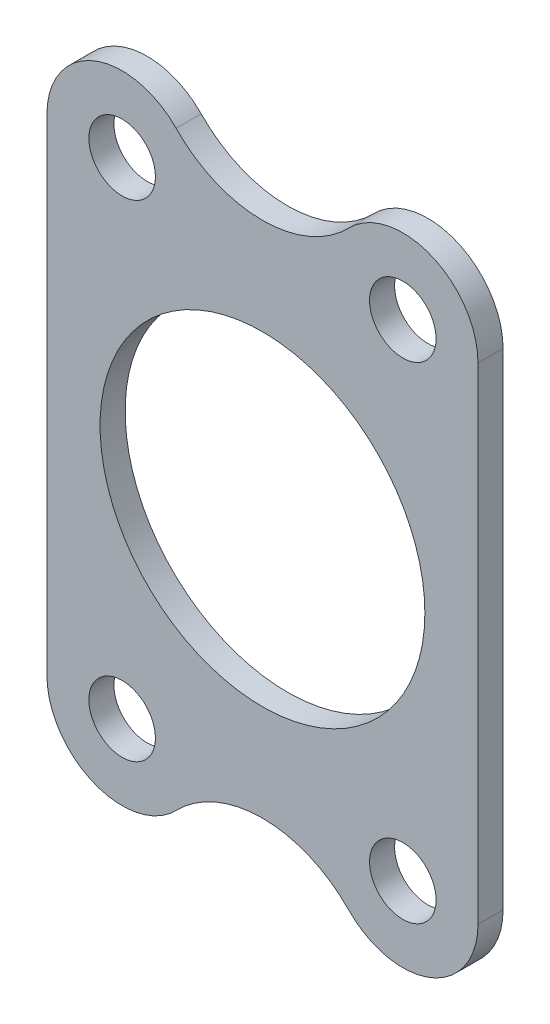
ISO-10303-21;
HEADER;
FILE_DESCRIPTION(('STEP AP214'),'2;1');
FILE_NAME('part.step','',(''),(''),'','','');
FILE_SCHEMA(('AUTOMOTIVE_DESIGN { 1 0 10303 214 1 1 1 1 }'));
ENDSEC;
DATA;
#1=APPLICATION_CONTEXT('core data for automotive mechanical design processes');
#2=APPLICATION_PROTOCOL_DEFINITION('international standard','automotive_design',2000,#1);
#3=PRODUCT_CONTEXT('',#1,'mechanical');
#4=PRODUCT('Part','Part','',(#3));
#5=PRODUCT_RELATED_PRODUCT_CATEGORY('part','',(#4));
#6=PRODUCT_DEFINITION_FORMATION('','',#4);
#7=PRODUCT_DEFINITION_CONTEXT('part definition',#1,'design');
#8=PRODUCT_DEFINITION('design','',#6,#7);
#9=PRODUCT_DEFINITION_SHAPE('','',#8);
#10=(LENGTH_UNIT() NAMED_UNIT(*) SI_UNIT(.MILLI.,.METRE.));
#11=(NAMED_UNIT(*) PLANE_ANGLE_UNIT() SI_UNIT($,.RADIAN.));
#12=(NAMED_UNIT(*) SI_UNIT($,.STERADIAN.) SOLID_ANGLE_UNIT());
#13=UNCERTAINTY_MEASURE_WITH_UNIT(LENGTH_MEASURE(1.E-05),#10,'distance_accuracy_value','');
#14=(GEOMETRIC_REPRESENTATION_CONTEXT(3) GLOBAL_UNCERTAINTY_ASSIGNED_CONTEXT((#13)) GLOBAL_UNIT_ASSIGNED_CONTEXT((#10,
#11,#12)) REPRESENTATION_CONTEXT('',''));
#15=CARTESIAN_POINT('',(0.,0.,0.));
#16=DIRECTION('',(0.,0.,1.));
#17=DIRECTION('',(1.,0.,0.));
#18=AXIS2_PLACEMENT_3D('',#15,#16,#17);
#19=CARTESIAN_POINT('',(0.,24.0173403742038,18.0975));
#20=DIRECTION('',(0.,0.,1.));
#21=DIRECTION('',(1.,0.,0.));
#22=AXIS2_PLACEMENT_3D('',#19,#20,#21);
#23=PLANE('',#22);
#24=CARTESIAN_POINT('',(8.8899999999999,15.3979316792874,18.0975));
#25=DIRECTION('',(0.,0.,1.));
#26=DIRECTION('',(1.,0.,0.));
#27=AXIS2_PLACEMENT_3D('',#24,#25,#26);
#28=CIRCLE('',#27,2.1082);
#29=CARTESIAN_POINT('',(10.9981999999999,15.3979316792874,18.0975));
#30=VERTEX_POINT('',#29);
#31=EDGE_CURVE('E253',#30,#30,#28,.T.);
#32=ORIENTED_EDGE('',*,*,#31,.F.);
#33=EDGE_LOOP('',(#32));
#34=FACE_BOUND('',#33,.T.);
#35=CARTESIAN_POINT('',(-8.8899999999999,-15.3979316792874,18.0975));
#36=DIRECTION('',(0.,0.,1.));
#37=DIRECTION('',(1.,0.,0.));
#38=AXIS2_PLACEMENT_3D('',#35,#36,#37);
#39=CIRCLE('',#38,2.1082);
#40=CARTESIAN_POINT('',(-6.7817999999999,-15.3979316792874,18.0975));
#41=VERTEX_POINT('',#40);
#42=EDGE_CURVE('E237',#41,#41,#39,.T.);
#43=ORIENTED_EDGE('',*,*,#42,.F.);
#44=EDGE_LOOP('',(#43));
#45=FACE_BOUND('',#44,.T.);
#46=CARTESIAN_POINT('',(0.,24.0173403742038,18.0975));
#47=DIRECTION('',(0.,0.,-1.));
#48=DIRECTION('',(1.,0.,0.));
#49=AXIS2_PLACEMENT_3D('',#46,#47,#48);
#50=CIRCLE('',#49,7.62);
#51=CARTESIAN_POINT('',(5.47076923076917,18.7130888696399,18.0975));
#52=VERTEX_POINT('',#51);
#53=CARTESIAN_POINT('',(-5.47076923076917,18.7130888696399,18.0975));
#54=VERTEX_POINT('',#53);
#55=EDGE_CURVE('E188',#52,#54,#50,.T.);
#56=ORIENTED_EDGE('',*,*,#55,.T.);
#57=CARTESIAN_POINT('',(-8.8899999999999,15.3979316792874,18.0975));
#58=DIRECTION('',(0.,0.,1.));
#59=DIRECTION('',(1.,0.,0.));
#60=AXIS2_PLACEMENT_3D('',#57,#58,#59);
#61=CIRCLE('',#60,4.7625);
#62=CARTESIAN_POINT('',(-13.6524999999999,15.3979316792874,18.0975));
#63=VERTEX_POINT('',#62);
#64=EDGE_CURVE('E122',#54,#63,#61,.T.);
#65=ORIENTED_EDGE('',*,*,#64,.T.);
#66=DIRECTION('',(0.,-1.,0.));
#67=VECTOR('',#66,1.);
#68=CARTESIAN_POINT('',(-13.6524999999999,15.3979316792874,18.0975));
#69=LINE('',#68,#67);
#70=CARTESIAN_POINT('',(-13.6524999999999,-15.3979316792874,18.0975));
#71=VERTEX_POINT('',#70);
#72=EDGE_CURVE('E209',#63,#71,#69,.T.);
#73=ORIENTED_EDGE('',*,*,#72,.T.);
#74=CARTESIAN_POINT('',(-8.8899999999999,-15.3979316792874,18.0975));
#75=DIRECTION('',(0.,0.,1.));
#76=DIRECTION('',(1.,0.,0.));
#77=AXIS2_PLACEMENT_3D('',#74,#75,#76);
#78=CIRCLE('',#77,4.7625);
#79=CARTESIAN_POINT('',(-5.47076923076917,-18.7130888696399,18.0975));
#80=VERTEX_POINT('',#79);
#81=EDGE_CURVE('E223',#71,#80,#78,.T.);
#82=ORIENTED_EDGE('',*,*,#81,.T.);
#83=CARTESIAN_POINT('',(0.,-24.0173403742038,18.0975));
#84=DIRECTION('',(0.,0.,-1.));
#85=DIRECTION('',(1.,0.,0.));
#86=AXIS2_PLACEMENT_3D('',#83,#84,#85);
#87=CIRCLE('',#86,7.62);
#88=CARTESIAN_POINT('',(5.47076923076917,-18.7130888696399,18.0975));
#89=VERTEX_POINT('',#88);
#90=EDGE_CURVE('E143',#80,#89,#87,.T.);
#91=ORIENTED_EDGE('',*,*,#90,.T.);
#92=CARTESIAN_POINT('',(8.8899999999999,-15.3979316792874,18.0975));
#93=DIRECTION('',(0.,0.,1.));
#94=DIRECTION('',(1.,0.,0.));
#95=AXIS2_PLACEMENT_3D('',#92,#93,#94);
#96=CIRCLE('',#95,4.7625);
#97=CARTESIAN_POINT('',(13.6524999999999,-15.3979316792874,18.0975));
#98=VERTEX_POINT('',#97);
#99=EDGE_CURVE('E137',#89,#98,#96,.T.);
#100=ORIENTED_EDGE('',*,*,#99,.T.);
#101=DIRECTION('',(0.,1.,0.));
#102=VECTOR('',#101,1.);
#103=CARTESIAN_POINT('',(13.6524999999999,-15.3979316792874,18.0975));
#104=LINE('',#103,#102);
#105=CARTESIAN_POINT('',(13.6524999999999,15.3979316792874,18.0975));
#106=VERTEX_POINT('',#105);
#107=EDGE_CURVE('E141',#98,#106,#104,.T.);
#108=ORIENTED_EDGE('',*,*,#107,.T.);
#109=CARTESIAN_POINT('',(8.8899999999999,15.3979316792874,18.0975));
#110=DIRECTION('',(0.,0.,1.));
#111=DIRECTION('',(1.,0.,0.));
#112=AXIS2_PLACEMENT_3D('',#109,#110,#111);
#113=CIRCLE('',#112,4.7625);
#114=EDGE_CURVE('E70',#106,#52,#113,.T.);
#115=ORIENTED_EDGE('',*,*,#114,.T.);
#116=EDGE_LOOP('',(#56,#65,#73,#82,#91,#100,#108,#115));
#117=FACE_BOUND('',#116,.T.);
#118=CARTESIAN_POINT('',(8.8899999999999,-15.3979316792874,18.0975));
#119=DIRECTION('',(0.,0.,1.));
#120=DIRECTION('',(1.,0.,0.));
#121=AXIS2_PLACEMENT_3D('',#118,#119,#120);
#122=CIRCLE('',#121,2.1082);
#123=CARTESIAN_POINT('',(10.9981999999999,-15.3979316792874,18.0975));
#124=VERTEX_POINT('',#123);
#125=EDGE_CURVE('E170',#124,#124,#122,.T.);
#126=ORIENTED_EDGE('',*,*,#125,.F.);
#127=EDGE_LOOP('',(#126));
#128=FACE_BOUND('',#127,.T.);
#129=CARTESIAN_POINT('',(0.,0.,18.0975));
#130=DIRECTION('',(0.,0.,1.));
#131=DIRECTION('',(1.,0.,0.));
#132=AXIS2_PLACEMENT_3D('',#129,#130,#131);
#133=CIRCLE('',#132,10.287);
#134=CARTESIAN_POINT('',(10.287,0.,18.0975));
#135=VERTEX_POINT('',#134);
#136=EDGE_CURVE('E245',#135,#135,#133,.T.);
#137=ORIENTED_EDGE('',*,*,#136,.F.);
#138=EDGE_LOOP('',(#137));
#139=FACE_BOUND('',#138,.T.);
#140=CARTESIAN_POINT('',(-8.8899999999999,15.3979316792874,18.0975));
#141=DIRECTION('',(0.,0.,1.));
#142=DIRECTION('',(1.,0.,0.));
#143=AXIS2_PLACEMENT_3D('',#140,#141,#142);
#144=CIRCLE('',#143,2.1082);
#145=CARTESIAN_POINT('',(-6.7817999999999,15.3979316792874,18.0975));
#146=VERTEX_POINT('',#145);
#147=EDGE_CURVE('E261',#146,#146,#144,.T.);
#148=ORIENTED_EDGE('',*,*,#147,.F.);
#149=EDGE_LOOP('',(#148));
#150=FACE_BOUND('',#149,.T.);
#151=ADVANCED_FACE('F49',(#34,#45,#117,#128,#139,#150),#23,.T.);
#152=CARTESIAN_POINT('',(0.,24.0173403742038,16.51));
#153=DIRECTION('',(0.,0.,1.));
#154=DIRECTION('',(1.,0.,0.));
#155=AXIS2_PLACEMENT_3D('',#152,#153,#154);
#156=PLANE('',#155);
#157=CARTESIAN_POINT('',(0.,24.0173403742038,16.51));
#158=DIRECTION('',(0.,0.,-1.));
#159=DIRECTION('',(1.,0.,0.));
#160=AXIS2_PLACEMENT_3D('',#157,#158,#159);
#161=CIRCLE('',#160,7.62);
#162=CARTESIAN_POINT('',(5.47076923076917,18.7130888696399,16.51));
#163=VERTEX_POINT('',#162);
#164=CARTESIAN_POINT('',(-5.47076923076917,18.7130888696399,16.51));
#165=VERTEX_POINT('',#164);
#166=EDGE_CURVE('E165',#163,#165,#161,.T.);
#167=ORIENTED_EDGE('',*,*,#166,.F.);
#168=CARTESIAN_POINT('',(8.8899999999999,15.3979316792874,16.51));
#169=DIRECTION('',(0.,0.,1.));
#170=DIRECTION('',(1.,0.,0.));
#171=AXIS2_PLACEMENT_3D('',#168,#169,#170);
#172=CIRCLE('',#171,4.7625);
#173=CARTESIAN_POINT('',(13.6524999999999,15.3979316792874,16.51));
#174=VERTEX_POINT('',#173);
#175=EDGE_CURVE('E114',#174,#163,#172,.T.);
#176=ORIENTED_EDGE('',*,*,#175,.F.);
#177=DIRECTION('',(0.,1.,0.));
#178=VECTOR('',#177,1.);
#179=CARTESIAN_POINT('',(13.6524999999999,-15.3979316792874,16.51));
#180=LINE('',#179,#178);
#181=CARTESIAN_POINT('',(13.6524999999999,-15.3979316792874,16.51));
#182=VERTEX_POINT('',#181);
#183=EDGE_CURVE('E107',#182,#174,#180,.T.);
#184=ORIENTED_EDGE('',*,*,#183,.F.);
#185=CARTESIAN_POINT('',(8.8899999999999,-15.3979316792874,16.51));
#186=DIRECTION('',(0.,0.,1.));
#187=DIRECTION('',(1.,0.,0.));
#188=AXIS2_PLACEMENT_3D('',#185,#186,#187);
#189=CIRCLE('',#188,4.7625);
#190=CARTESIAN_POINT('',(5.47076923076917,-18.7130888696399,16.51));
#191=VERTEX_POINT('',#190);
#192=EDGE_CURVE('E152',#191,#182,#189,.T.);
#193=ORIENTED_EDGE('',*,*,#192,.F.);
#194=CARTESIAN_POINT('',(0.,-24.0173403742038,16.51));
#195=DIRECTION('',(0.,0.,-1.));
#196=DIRECTION('',(1.,0.,0.));
#197=AXIS2_PLACEMENT_3D('',#194,#195,#196);
#198=CIRCLE('',#197,7.62);
#199=CARTESIAN_POINT('',(-5.47076923076917,-18.7130888696399,16.51));
#200=VERTEX_POINT('',#199);
#201=EDGE_CURVE('E179',#200,#191,#198,.T.);
#202=ORIENTED_EDGE('',*,*,#201,.F.);
#203=CARTESIAN_POINT('',(-8.8899999999999,-15.3979316792874,16.51));
#204=DIRECTION('',(0.,0.,1.));
#205=DIRECTION('',(1.,0.,0.));
#206=AXIS2_PLACEMENT_3D('',#203,#204,#205);
#207=CIRCLE('',#206,4.7625);
#208=CARTESIAN_POINT('',(-13.6524999999999,-15.3979316792874,16.51));
#209=VERTEX_POINT('',#208);
#210=EDGE_CURVE('E176',#209,#200,#207,.T.);
#211=ORIENTED_EDGE('',*,*,#210,.F.);
#212=DIRECTION('',(0.,-1.,0.));
#213=VECTOR('',#212,1.);
#214=CARTESIAN_POINT('',(-13.6524999999999,15.3979316792874,16.51));
#215=LINE('',#214,#213);
#216=CARTESIAN_POINT('',(-13.6524999999999,15.3979316792874,16.51));
#217=VERTEX_POINT('',#216);
#218=EDGE_CURVE('E173',#217,#209,#215,.T.);
#219=ORIENTED_EDGE('',*,*,#218,.F.);
#220=CARTESIAN_POINT('',(-8.8899999999999,15.3979316792874,16.51));
#221=DIRECTION('',(0.,0.,1.));
#222=DIRECTION('',(1.,0.,0.));
#223=AXIS2_PLACEMENT_3D('',#220,#221,#222);
#224=CIRCLE('',#223,4.7625);
#225=EDGE_CURVE('E169',#165,#217,#224,.T.);
#226=ORIENTED_EDGE('',*,*,#225,.F.);
#227=EDGE_LOOP('',(#167,#176,#184,#193,#202,#211,#219,#226));
#228=FACE_BOUND('',#227,.T.);
#229=CARTESIAN_POINT('',(8.8899999999999,-15.3979316792874,16.51));
#230=DIRECTION('',(0.,0.,1.));
#231=DIRECTION('',(1.,0.,0.));
#232=AXIS2_PLACEMENT_3D('',#229,#230,#231);
#233=CIRCLE('',#232,2.1082);
#234=CARTESIAN_POINT('',(10.9981999999999,-15.3979316792874,16.51));
#235=VERTEX_POINT('',#234);
#236=EDGE_CURVE('E233',#235,#235,#233,.T.);
#237=ORIENTED_EDGE('',*,*,#236,.T.);
#238=EDGE_LOOP('',(#237));
#239=FACE_BOUND('',#238,.T.);
#240=CARTESIAN_POINT('',(-8.8899999999999,-15.3979316792874,16.51));
#241=DIRECTION('',(0.,0.,1.));
#242=DIRECTION('',(1.,0.,0.));
#243=AXIS2_PLACEMENT_3D('',#240,#241,#242);
#244=CIRCLE('',#243,2.1082);
#245=CARTESIAN_POINT('',(-6.7817999999999,-15.3979316792874,16.51));
#246=VERTEX_POINT('',#245);
#247=EDGE_CURVE('E241',#246,#246,#244,.T.);
#248=ORIENTED_EDGE('',*,*,#247,.T.);
#249=EDGE_LOOP('',(#248));
#250=FACE_BOUND('',#249,.T.);
#251=CARTESIAN_POINT('',(0.,0.,16.51));
#252=DIRECTION('',(0.,0.,1.));
#253=DIRECTION('',(1.,0.,0.));
#254=AXIS2_PLACEMENT_3D('',#251,#252,#253);
#255=CIRCLE('',#254,10.287);
#256=CARTESIAN_POINT('',(10.287,0.,16.51));
#257=VERTEX_POINT('',#256);
#258=EDGE_CURVE('E249',#257,#257,#255,.T.);
#259=ORIENTED_EDGE('',*,*,#258,.T.);
#260=EDGE_LOOP('',(#259));
#261=FACE_BOUND('',#260,.T.);
#262=CARTESIAN_POINT('',(8.8899999999999,15.3979316792874,16.51));
#263=DIRECTION('',(0.,0.,1.));
#264=DIRECTION('',(1.,0.,0.));
#265=AXIS2_PLACEMENT_3D('',#262,#263,#264);
#266=CIRCLE('',#265,2.1082);
#267=CARTESIAN_POINT('',(10.9981999999999,15.3979316792874,16.51));
#268=VERTEX_POINT('',#267);
#269=EDGE_CURVE('E257',#268,#268,#266,.T.);
#270=ORIENTED_EDGE('',*,*,#269,.T.);
#271=EDGE_LOOP('',(#270));
#272=FACE_BOUND('',#271,.T.);
#273=CARTESIAN_POINT('',(-8.8899999999999,15.3979316792874,16.51));
#274=DIRECTION('',(0.,0.,1.));
#275=DIRECTION('',(1.,0.,0.));
#276=AXIS2_PLACEMENT_3D('',#273,#274,#275);
#277=CIRCLE('',#276,2.1082);
#278=CARTESIAN_POINT('',(-6.7817999999999,15.3979316792874,16.51));
#279=VERTEX_POINT('',#278);
#280=EDGE_CURVE('E265',#279,#279,#277,.T.);
#281=ORIENTED_EDGE('',*,*,#280,.T.);
#282=EDGE_LOOP('',(#281));
#283=FACE_BOUND('',#282,.T.);
#284=ADVANCED_FACE('F213',(#228,#239,#250,#261,#272,#283),#156,.F.);
#285=CARTESIAN_POINT('',(0.,24.0173403742038,18.0975));
#286=DIRECTION('',(0.,0.,-1.));
#287=DIRECTION('',(-1.,0.,0.));
#288=AXIS2_PLACEMENT_3D('',#285,#286,#287);
#289=CYLINDRICAL_SURFACE('',#288,7.62);
#290=ORIENTED_EDGE('',*,*,#166,.T.);
#291=DIRECTION('',(0.,0.,-1.));
#292=VECTOR('',#291,1.);
#293=CARTESIAN_POINT('',(-5.47076923076917,18.7130888696399,18.0975));
#294=LINE('',#293,#292);
#295=EDGE_CURVE('E11',#54,#165,#294,.T.);
#296=ORIENTED_EDGE('',*,*,#295,.F.);
#297=ORIENTED_EDGE('',*,*,#55,.F.);
#298=DIRECTION('',(0.,0.,-1.));
#299=VECTOR('',#298,1.);
#300=CARTESIAN_POINT('',(5.47076923076917,18.7130888696399,18.0975));
#301=LINE('',#300,#299);
#302=EDGE_CURVE('E161',#52,#163,#301,.T.);
#303=ORIENTED_EDGE('',*,*,#302,.T.);
#304=EDGE_LOOP('',(#290,#296,#297,#303));
#305=FACE_BOUND('',#304,.T.);
#306=ADVANCED_FACE('F51',(#305),#289,.F.);
#307=CARTESIAN_POINT('',(-8.8899999999999,15.3979316792874,18.0975));
#308=DIRECTION('',(0.,0.,-1.));
#309=DIRECTION('',(-1.,0.,0.));
#310=AXIS2_PLACEMENT_3D('',#307,#308,#309);
#311=CYLINDRICAL_SURFACE('',#310,4.7625);
#312=ORIENTED_EDGE('',*,*,#225,.T.);
#313=DIRECTION('',(0.,0.,-1.));
#314=VECTOR('',#313,1.);
#315=CARTESIAN_POINT('',(-13.6524999999999,15.3979316792874,18.0975));
#316=LINE('',#315,#314);
#317=EDGE_CURVE('E59',#63,#217,#316,.T.);
#318=ORIENTED_EDGE('',*,*,#317,.F.);
#319=ORIENTED_EDGE('',*,*,#64,.F.);
#320=ORIENTED_EDGE('',*,*,#295,.T.);
#321=EDGE_LOOP('',(#312,#318,#319,#320));
#322=FACE_BOUND('',#321,.T.);
#323=ADVANCED_FACE('F300',(#322),#311,.T.);
#324=CARTESIAN_POINT('',(-13.6524999999999,15.3979316792874,18.0975));
#325=DIRECTION('',(1.,0.,0.));
#326=DIRECTION('',(0.,0.,-1.));
#327=AXIS2_PLACEMENT_3D('',#324,#325,#326);
#328=PLANE('',#327);
#329=ORIENTED_EDGE('',*,*,#218,.T.);
#330=DIRECTION('',(0.,0.,-1.));
#331=VECTOR('',#330,1.);
#332=CARTESIAN_POINT('',(-13.6524999999999,-15.3979316792874,18.0975));
#333=LINE('',#332,#331);
#334=EDGE_CURVE('E199',#71,#209,#333,.T.);
#335=ORIENTED_EDGE('',*,*,#334,.F.);
#336=ORIENTED_EDGE('',*,*,#72,.F.);
#337=ORIENTED_EDGE('',*,*,#317,.T.);
#338=EDGE_LOOP('',(#329,#335,#336,#337));
#339=FACE_BOUND('',#338,.T.);
#340=ADVANCED_FACE('F207',(#339),#328,.F.);
#341=CARTESIAN_POINT('',(-8.8899999999999,-15.3979316792874,18.0975));
#342=DIRECTION('',(0.,0.,-1.));
#343=DIRECTION('',(-1.,0.,0.));
#344=AXIS2_PLACEMENT_3D('',#341,#342,#343);
#345=CYLINDRICAL_SURFACE('',#344,4.7625);
#346=ORIENTED_EDGE('',*,*,#210,.T.);
#347=DIRECTION('',(0.,0.,-1.));
#348=VECTOR('',#347,1.);
#349=CARTESIAN_POINT('',(-5.47076923076917,-18.7130888696399,18.0975));
#350=LINE('',#349,#348);
#351=EDGE_CURVE('E195',#80,#200,#350,.T.);
#352=ORIENTED_EDGE('',*,*,#351,.F.);
#353=ORIENTED_EDGE('',*,*,#81,.F.);
#354=ORIENTED_EDGE('',*,*,#334,.T.);
#355=EDGE_LOOP('',(#346,#352,#353,#354));
#356=FACE_BOUND('',#355,.T.);
#357=ADVANCED_FACE('F218',(#356),#345,.T.);
#358=CARTESIAN_POINT('',(0.,-24.0173403742038,18.0975));
#359=DIRECTION('',(0.,0.,-1.));
#360=DIRECTION('',(-1.,0.,0.));
#361=AXIS2_PLACEMENT_3D('',#358,#359,#360);
#362=CYLINDRICAL_SURFACE('',#361,7.62);
#363=ORIENTED_EDGE('',*,*,#201,.T.);
#364=DIRECTION('',(0.,0.,-1.));
#365=VECTOR('',#364,1.);
#366=CARTESIAN_POINT('',(5.47076923076917,-18.7130888696399,18.0975));
#367=LINE('',#366,#365);
#368=EDGE_CURVE('E154',#89,#191,#367,.T.);
#369=ORIENTED_EDGE('',*,*,#368,.F.);
#370=ORIENTED_EDGE('',*,*,#90,.F.);
#371=ORIENTED_EDGE('',*,*,#351,.T.);
#372=EDGE_LOOP('',(#363,#369,#370,#371));
#373=FACE_BOUND('',#372,.T.);
#374=ADVANCED_FACE('F221',(#373),#362,.F.);
#375=CARTESIAN_POINT('',(8.8899999999999,-15.3979316792874,18.0975));
#376=DIRECTION('',(0.,0.,-1.));
#377=DIRECTION('',(-1.,0.,0.));
#378=AXIS2_PLACEMENT_3D('',#375,#376,#377);
#379=CYLINDRICAL_SURFACE('',#378,4.7625);
#380=ORIENTED_EDGE('',*,*,#192,.T.);
#381=DIRECTION('',(0.,0.,-1.));
#382=VECTOR('',#381,1.);
#383=CARTESIAN_POINT('',(13.6524999999999,-15.3979316792874,18.0975));
#384=LINE('',#383,#382);
#385=EDGE_CURVE('E149',#98,#182,#384,.T.);
#386=ORIENTED_EDGE('',*,*,#385,.F.);
#387=ORIENTED_EDGE('',*,*,#99,.F.);
#388=ORIENTED_EDGE('',*,*,#368,.T.);
#389=EDGE_LOOP('',(#380,#386,#387,#388));
#390=FACE_BOUND('',#389,.T.);
#391=ADVANCED_FACE('F150',(#390),#379,.T.);
#392=CARTESIAN_POINT('',(13.6524999999999,-15.3979316792874,18.0975));
#393=DIRECTION('',(-1.,0.,0.));
#394=DIRECTION('',(0.,0.,1.));
#395=AXIS2_PLACEMENT_3D('',#392,#393,#394);
#396=PLANE('',#395);
#397=ORIENTED_EDGE('',*,*,#183,.T.);
#398=DIRECTION('',(0.,0.,-1.));
#399=VECTOR('',#398,1.);
#400=CARTESIAN_POINT('',(13.6524999999999,15.3979316792874,18.0975));
#401=LINE('',#400,#399);
#402=EDGE_CURVE('E155',#106,#174,#401,.T.);
#403=ORIENTED_EDGE('',*,*,#402,.F.);
#404=ORIENTED_EDGE('',*,*,#107,.F.);
#405=ORIENTED_EDGE('',*,*,#385,.T.);
#406=EDGE_LOOP('',(#397,#403,#404,#405));
#407=FACE_BOUND('',#406,.T.);
#408=ADVANCED_FACE('F157',(#407),#396,.F.);
#409=CARTESIAN_POINT('',(8.8899999999999,15.3979316792874,18.0975));
#410=DIRECTION('',(0.,0.,-1.));
#411=DIRECTION('',(-1.,0.,0.));
#412=AXIS2_PLACEMENT_3D('',#409,#410,#411);
#413=CYLINDRICAL_SURFACE('',#412,4.7625);
#414=ORIENTED_EDGE('',*,*,#175,.T.);
#415=ORIENTED_EDGE('',*,*,#302,.F.);
#416=ORIENTED_EDGE('',*,*,#114,.F.);
#417=ORIENTED_EDGE('',*,*,#402,.T.);
#418=EDGE_LOOP('',(#414,#415,#416,#417));
#419=FACE_BOUND('',#418,.T.);
#420=ADVANCED_FACE('F289',(#419),#413,.T.);
#421=CARTESIAN_POINT('',(8.8899999999999,-15.3979316792874,18.0975));
#422=DIRECTION('',(0.,0.,-1.));
#423=DIRECTION('',(-1.,0.,0.));
#424=AXIS2_PLACEMENT_3D('',#421,#422,#423);
#425=CYLINDRICAL_SURFACE('',#424,2.1082);
#426=ORIENTED_EDGE('',*,*,#125,.T.);
#427=EDGE_LOOP('',(#426));
#428=FACE_BOUND('',#427,.T.);
#429=ORIENTED_EDGE('',*,*,#236,.F.);
#430=EDGE_LOOP('',(#429));
#431=FACE_BOUND('',#430,.T.);
#432=ADVANCED_FACE('F286',(#428,#431),#425,.F.);
#433=CARTESIAN_POINT('',(-8.8899999999999,-15.3979316792874,18.0975));
#434=DIRECTION('',(0.,0.,-1.));
#435=DIRECTION('',(-1.,0.,0.));
#436=AXIS2_PLACEMENT_3D('',#433,#434,#435);
#437=CYLINDRICAL_SURFACE('',#436,2.1082);
#438=ORIENTED_EDGE('',*,*,#42,.T.);
#439=EDGE_LOOP('',(#438));
#440=FACE_BOUND('',#439,.T.);
#441=ORIENTED_EDGE('',*,*,#247,.F.);
#442=EDGE_LOOP('',(#441));
#443=FACE_BOUND('',#442,.T.);
#444=ADVANCED_FACE('F323',(#440,#443),#437,.F.);
#445=CARTESIAN_POINT('',(0.,0.,18.0975));
#446=DIRECTION('',(0.,0.,-1.));
#447=DIRECTION('',(-1.,0.,0.));
#448=AXIS2_PLACEMENT_3D('',#445,#446,#447);
#449=CYLINDRICAL_SURFACE('',#448,10.287);
#450=ORIENTED_EDGE('',*,*,#136,.T.);
#451=EDGE_LOOP('',(#450));
#452=FACE_BOUND('',#451,.T.);
#453=ORIENTED_EDGE('',*,*,#258,.F.);
#454=EDGE_LOOP('',(#453));
#455=FACE_BOUND('',#454,.T.);
#456=ADVANCED_FACE('F320',(#452,#455),#449,.F.);
#457=CARTESIAN_POINT('',(8.8899999999999,15.3979316792874,18.0975));
#458=DIRECTION('',(0.,0.,-1.));
#459=DIRECTION('',(-1.,0.,0.));
#460=AXIS2_PLACEMENT_3D('',#457,#458,#459);
#461=CYLINDRICAL_SURFACE('',#460,2.1082);
#462=ORIENTED_EDGE('',*,*,#31,.T.);
#463=EDGE_LOOP('',(#462));
#464=FACE_BOUND('',#463,.T.);
#465=ORIENTED_EDGE('',*,*,#269,.F.);
#466=EDGE_LOOP('',(#465));
#467=FACE_BOUND('',#466,.T.);
#468=ADVANCED_FACE('F322',(#464,#467),#461,.F.);
#469=CARTESIAN_POINT('',(-8.8899999999999,15.3979316792874,18.0975));
#470=DIRECTION('',(0.,0.,-1.));
#471=DIRECTION('',(-1.,0.,0.));
#472=AXIS2_PLACEMENT_3D('',#469,#470,#471);
#473=CYLINDRICAL_SURFACE('',#472,2.1082);
#474=ORIENTED_EDGE('',*,*,#147,.T.);
#475=EDGE_LOOP('',(#474));
#476=FACE_BOUND('',#475,.T.);
#477=ORIENTED_EDGE('',*,*,#280,.F.);
#478=EDGE_LOOP('',(#477));
#479=FACE_BOUND('',#478,.T.);
#480=ADVANCED_FACE('F273',(#476,#479),#473,.F.);
#481=CLOSED_SHELL('',(#151,#284,#306,#323,#340,#357,#374,#391,#408,#420,#432,#444,#456,#468,#480));
#482=MANIFOLD_SOLID_BREP('B2',#481);
#483=ADVANCED_BREP_SHAPE_REPRESENTATION('',(#18,#482),#14);
#484=SHAPE_DEFINITION_REPRESENTATION(#9,#483);
ENDSEC;
END-ISO-10303-21;
